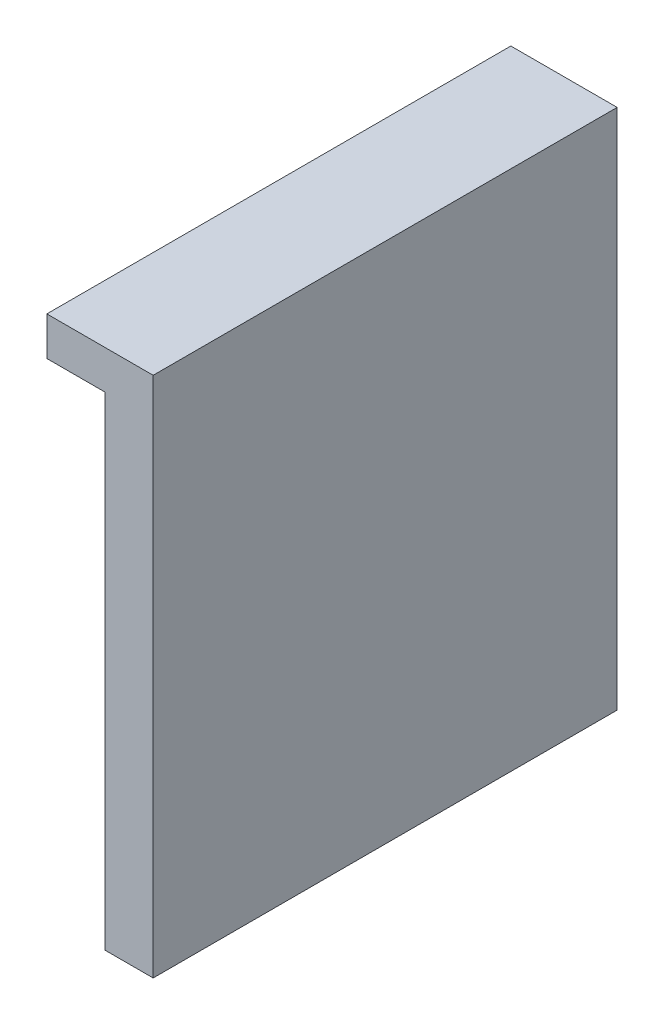
ISO-10303-21;
HEADER;
FILE_DESCRIPTION(('STEP AP214'),'2;1');
FILE_NAME('part.step','',(''),(''),'','','');
FILE_SCHEMA(('AUTOMOTIVE_DESIGN { 1 0 10303 214 1 1 1 1 }'));
ENDSEC;
DATA;
#1=APPLICATION_CONTEXT('core data for automotive mechanical design processes');
#2=APPLICATION_PROTOCOL_DEFINITION('international standard','automotive_design',2000,#1);
#3=PRODUCT_CONTEXT('',#1,'mechanical');
#4=PRODUCT('Part','Part','',(#3));
#5=PRODUCT_RELATED_PRODUCT_CATEGORY('part','',(#4));
#6=PRODUCT_DEFINITION_FORMATION('','',#4);
#7=PRODUCT_DEFINITION_CONTEXT('part definition',#1,'design');
#8=PRODUCT_DEFINITION('design','',#6,#7);
#9=PRODUCT_DEFINITION_SHAPE('','',#8);
#10=(LENGTH_UNIT() NAMED_UNIT(*) SI_UNIT(.MILLI.,.METRE.));
#11=(NAMED_UNIT(*) PLANE_ANGLE_UNIT() SI_UNIT($,.RADIAN.));
#12=(NAMED_UNIT(*) SI_UNIT($,.STERADIAN.) SOLID_ANGLE_UNIT());
#13=UNCERTAINTY_MEASURE_WITH_UNIT(LENGTH_MEASURE(1.E-05),#10,'distance_accuracy_value','');
#14=(GEOMETRIC_REPRESENTATION_CONTEXT(3) GLOBAL_UNCERTAINTY_ASSIGNED_CONTEXT((#13)) GLOBAL_UNIT_ASSIGNED_CONTEXT((#10,
#11,#12)) REPRESENTATION_CONTEXT('',''));
#15=CARTESIAN_POINT('',(0.,0.,0.));
#16=DIRECTION('',(0.,0.,1.));
#17=DIRECTION('',(1.,0.,0.));
#18=AXIS2_PLACEMENT_3D('',#15,#16,#17);
#19=CARTESIAN_POINT('',(0.,23.,-24.));
#20=DIRECTION('',(0.,0.,-1.));
#21=DIRECTION('',(-1.,0.,0.));
#22=AXIS2_PLACEMENT_3D('',#19,#20,#21);
#23=PLANE('',#22);
#24=DIRECTION('',(-1.,0.,0.));
#25=VECTOR('',#24,1.);
#26=CARTESIAN_POINT('',(3.,25.,-24.));
#27=LINE('',#26,#25);
#28=CARTESIAN_POINT('',(2.5,25.,-24.));
#29=VERTEX_POINT('',#28);
#30=CARTESIAN_POINT('',(-3.,25.,-24.));
#31=VERTEX_POINT('',#30);
#32=EDGE_CURVE('E110',#29,#31,#27,.T.);
#33=ORIENTED_EDGE('',*,*,#32,.F.);
#34=DIRECTION('',(0.,1.,0.));
#35=VECTOR('',#34,1.);
#36=CARTESIAN_POINT('',(2.5,25.,-24.));
#37=LINE('',#36,#35);
#38=CARTESIAN_POINT('',(2.5,-2.,-24.));
#39=VERTEX_POINT('',#38);
#40=EDGE_CURVE('E97',#39,#29,#37,.T.);
#41=ORIENTED_EDGE('',*,*,#40,.F.);
#42=DIRECTION('',(1.,0.,0.));
#43=VECTOR('',#42,1.);
#44=CARTESIAN_POINT('',(0.,-2.,-24.));
#45=LINE('',#44,#43);
#46=CARTESIAN_POINT('',(0.,-2.,-24.));
#47=VERTEX_POINT('',#46);
#48=EDGE_CURVE('E107',#47,#39,#45,.T.);
#49=ORIENTED_EDGE('',*,*,#48,.F.);
#50=DIRECTION('',(0.,-1.,0.));
#51=VECTOR('',#50,1.);
#52=CARTESIAN_POINT('',(0.,23.,-24.));
#53=LINE('',#52,#51);
#54=CARTESIAN_POINT('',(0.,23.,-24.));
#55=VERTEX_POINT('',#54);
#56=EDGE_CURVE('E11',#55,#47,#53,.T.);
#57=ORIENTED_EDGE('',*,*,#56,.F.);
#58=DIRECTION('',(-1.,0.,0.));
#59=VECTOR('',#58,1.);
#60=CARTESIAN_POINT('',(3.,23.,-24.));
#61=LINE('',#60,#59);
#62=CARTESIAN_POINT('',(-3.,23.,-24.));
#63=VERTEX_POINT('',#62);
#64=EDGE_CURVE('E68',#55,#63,#61,.T.);
#65=ORIENTED_EDGE('',*,*,#64,.T.);
#66=DIRECTION('',(0.,-1.,0.));
#67=VECTOR('',#66,1.);
#68=CARTESIAN_POINT('',(-3.,25.,-24.));
#69=LINE('',#68,#67);
#70=EDGE_CURVE('E147',#31,#63,#69,.T.);
#71=ORIENTED_EDGE('',*,*,#70,.F.);
#72=EDGE_LOOP('',(#33,#41,#49,#57,#65,#71));
#73=FACE_BOUND('',#72,.T.);
#74=ADVANCED_FACE('F45',(#73),#23,.T.);
#75=CARTESIAN_POINT('',(0.,23.,0.));
#76=DIRECTION('',(0.,0.,-1.));
#77=DIRECTION('',(-1.,0.,0.));
#78=AXIS2_PLACEMENT_3D('',#75,#76,#77);
#79=PLANE('',#78);
#80=DIRECTION('',(0.,-1.,0.));
#81=VECTOR('',#80,1.);
#82=CARTESIAN_POINT('',(2.5,25.,0.));
#83=LINE('',#82,#81);
#84=CARTESIAN_POINT('',(2.5,25.,0.));
#85=VERTEX_POINT('',#84);
#86=CARTESIAN_POINT('',(2.5,-2.,0.));
#87=VERTEX_POINT('',#86);
#88=EDGE_CURVE('E60',#85,#87,#83,.T.);
#89=ORIENTED_EDGE('',*,*,#88,.F.);
#90=DIRECTION('',(-1.,0.,0.));
#91=VECTOR('',#90,1.);
#92=CARTESIAN_POINT('',(3.,25.,0.));
#93=LINE('',#92,#91);
#94=CARTESIAN_POINT('',(-3.,25.,0.));
#95=VERTEX_POINT('',#94);
#96=EDGE_CURVE('E133',#85,#95,#93,.T.);
#97=ORIENTED_EDGE('',*,*,#96,.T.);
#98=DIRECTION('',(0.,-1.,0.));
#99=VECTOR('',#98,1.);
#100=CARTESIAN_POINT('',(-3.,25.,0.));
#101=LINE('',#100,#99);
#102=CARTESIAN_POINT('',(-3.,23.,0.));
#103=VERTEX_POINT('',#102);
#104=EDGE_CURVE('E136',#95,#103,#101,.T.);
#105=ORIENTED_EDGE('',*,*,#104,.T.);
#106=DIRECTION('',(-1.,0.,0.));
#107=VECTOR('',#106,1.);
#108=CARTESIAN_POINT('',(3.,23.,0.));
#109=LINE('',#108,#107);
#110=CARTESIAN_POINT('',(0.,23.,0.));
#111=VERTEX_POINT('',#110);
#112=EDGE_CURVE('E129',#111,#103,#109,.T.);
#113=ORIENTED_EDGE('',*,*,#112,.F.);
#114=DIRECTION('',(0.,-1.,0.));
#115=VECTOR('',#114,1.);
#116=CARTESIAN_POINT('',(0.,23.,0.));
#117=LINE('',#116,#115);
#118=CARTESIAN_POINT('',(0.,-2.,0.));
#119=VERTEX_POINT('',#118);
#120=EDGE_CURVE('E48',#111,#119,#117,.T.);
#121=ORIENTED_EDGE('',*,*,#120,.T.);
#122=DIRECTION('',(-1.,0.,0.));
#123=VECTOR('',#122,1.);
#124=CARTESIAN_POINT('',(0.,-2.,0.));
#125=LINE('',#124,#123);
#126=EDGE_CURVE('E118',#87,#119,#125,.T.);
#127=ORIENTED_EDGE('',*,*,#126,.F.);
#128=EDGE_LOOP('',(#89,#97,#105,#113,#121,#127));
#129=FACE_BOUND('',#128,.T.);
#130=ADVANCED_FACE('F160',(#129),#79,.F.);
#131=CARTESIAN_POINT('',(0.,25.,0.));
#132=DIRECTION('',(0.,-1.,0.));
#133=DIRECTION('',(0.,0.,-1.));
#134=AXIS2_PLACEMENT_3D('',#131,#132,#133);
#135=PLANE('',#134);
#136=DIRECTION('',(0.,0.,1.));
#137=VECTOR('',#136,1.);
#138=CARTESIAN_POINT('',(2.5,25.,0.));
#139=LINE('',#138,#137);
#140=EDGE_CURVE('E112',#29,#85,#139,.T.);
#141=ORIENTED_EDGE('',*,*,#140,.F.);
#142=ORIENTED_EDGE('',*,*,#32,.T.);
#143=DIRECTION('',(0.,0.,-1.));
#144=VECTOR('',#143,1.);
#145=CARTESIAN_POINT('',(-3.,25.,0.));
#146=LINE('',#145,#144);
#147=EDGE_CURVE('E128',#95,#31,#146,.T.);
#148=ORIENTED_EDGE('',*,*,#147,.F.);
#149=ORIENTED_EDGE('',*,*,#96,.F.);
#150=EDGE_LOOP('',(#141,#142,#148,#149));
#151=FACE_BOUND('',#150,.T.);
#152=ADVANCED_FACE('F170',(#151),#135,.F.);
#153=CARTESIAN_POINT('',(0.,-2.,0.));
#154=DIRECTION('',(0.,-1.,0.));
#155=DIRECTION('',(0.,0.,-1.));
#156=AXIS2_PLACEMENT_3D('',#153,#154,#155);
#157=PLANE('',#156);
#158=ORIENTED_EDGE('',*,*,#48,.T.);
#159=DIRECTION('',(0.,0.,-1.));
#160=VECTOR('',#159,1.);
#161=CARTESIAN_POINT('',(2.5,-2.,0.));
#162=LINE('',#161,#160);
#163=EDGE_CURVE('E94',#87,#39,#162,.T.);
#164=ORIENTED_EDGE('',*,*,#163,.F.);
#165=ORIENTED_EDGE('',*,*,#126,.T.);
#166=DIRECTION('',(0.,0.,-1.));
#167=VECTOR('',#166,1.);
#168=CARTESIAN_POINT('',(0.,-2.,0.));
#169=LINE('',#168,#167);
#170=EDGE_CURVE('E116',#119,#47,#169,.T.);
#171=ORIENTED_EDGE('',*,*,#170,.T.);
#172=EDGE_LOOP('',(#158,#164,#165,#171));
#173=FACE_BOUND('',#172,.T.);
#174=ADVANCED_FACE('F114',(#173),#157,.T.);
#175=CARTESIAN_POINT('',(0.,23.,0.));
#176=DIRECTION('',(-1.,0.,0.));
#177=DIRECTION('',(0.,0.,1.));
#178=AXIS2_PLACEMENT_3D('',#175,#176,#177);
#179=PLANE('',#178);
#180=ORIENTED_EDGE('',*,*,#56,.T.);
#181=ORIENTED_EDGE('',*,*,#170,.F.);
#182=ORIENTED_EDGE('',*,*,#120,.F.);
#183=DIRECTION('',(0.,0.,-1.));
#184=VECTOR('',#183,1.);
#185=CARTESIAN_POINT('',(0.,23.,0.));
#186=LINE('',#185,#184);
#187=EDGE_CURVE('E151',#111,#55,#186,.T.);
#188=ORIENTED_EDGE('',*,*,#187,.T.);
#189=EDGE_LOOP('',(#180,#181,#182,#188));
#190=FACE_BOUND('',#189,.T.);
#191=ADVANCED_FACE('F161',(#190),#179,.T.);
#192=CARTESIAN_POINT('',(0.,23.,0.));
#193=DIRECTION('',(0.,-1.,0.));
#194=DIRECTION('',(0.,0.,-1.));
#195=AXIS2_PLACEMENT_3D('',#192,#193,#194);
#196=PLANE('',#195);
#197=ORIENTED_EDGE('',*,*,#187,.F.);
#198=ORIENTED_EDGE('',*,*,#112,.T.);
#199=DIRECTION('',(0.,0.,-1.));
#200=VECTOR('',#199,1.);
#201=CARTESIAN_POINT('',(-3.,23.,0.));
#202=LINE('',#201,#200);
#203=EDGE_CURVE('E139',#103,#63,#202,.T.);
#204=ORIENTED_EDGE('',*,*,#203,.T.);
#205=ORIENTED_EDGE('',*,*,#64,.F.);
#206=EDGE_LOOP('',(#197,#198,#204,#205));
#207=FACE_BOUND('',#206,.T.);
#208=ADVANCED_FACE('F167',(#207),#196,.T.);
#209=CARTESIAN_POINT('',(-3.,25.,0.));
#210=DIRECTION('',(-1.,0.,0.));
#211=DIRECTION('',(0.,0.,1.));
#212=AXIS2_PLACEMENT_3D('',#209,#210,#211);
#213=PLANE('',#212);
#214=ORIENTED_EDGE('',*,*,#203,.F.);
#215=ORIENTED_EDGE('',*,*,#104,.F.);
#216=ORIENTED_EDGE('',*,*,#147,.T.);
#217=ORIENTED_EDGE('',*,*,#70,.T.);
#218=EDGE_LOOP('',(#214,#215,#216,#217));
#219=FACE_BOUND('',#218,.T.);
#220=ADVANCED_FACE('F164',(#219),#213,.T.);
#221=CARTESIAN_POINT('',(2.5,0.,0.));
#222=DIRECTION('',(1.,0.,0.));
#223=DIRECTION('',(0.,0.,-1.));
#224=AXIS2_PLACEMENT_3D('',#221,#222,#223);
#225=PLANE('',#224);
#226=ORIENTED_EDGE('',*,*,#88,.T.);
#227=ORIENTED_EDGE('',*,*,#163,.T.);
#228=ORIENTED_EDGE('',*,*,#40,.T.);
#229=ORIENTED_EDGE('',*,*,#140,.T.);
#230=EDGE_LOOP('',(#226,#227,#228,#229));
#231=FACE_BOUND('',#230,.T.);
#232=ADVANCED_FACE('F96',(#231),#225,.T.);
#233=CLOSED_SHELL('',(#74,#130,#152,#174,#191,#208,#220,#232));
#234=MANIFOLD_SOLID_BREP('B2',#233);
#235=ADVANCED_BREP_SHAPE_REPRESENTATION('',(#18,#234),#14);
#236=SHAPE_DEFINITION_REPRESENTATION(#9,#235);
ENDSEC;
END-ISO-10303-21;
